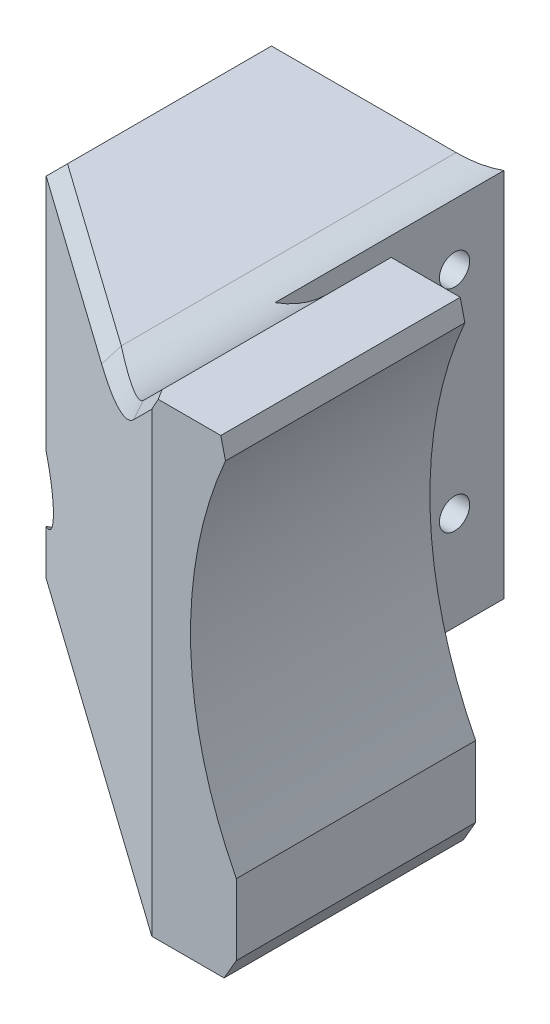
ISO-10303-21;
HEADER;
FILE_DESCRIPTION(('STEP AP214'),'2;1');
FILE_NAME('part.step','',(''),(''),'','','');
FILE_SCHEMA(('AUTOMOTIVE_DESIGN { 1 0 10303 214 1 1 1 1 }'));
ENDSEC;
DATA;
#1=APPLICATION_CONTEXT('core data for automotive mechanical design processes');
#2=APPLICATION_PROTOCOL_DEFINITION('international standard','automotive_design',2000,#1);
#3=PRODUCT_CONTEXT('',#1,'mechanical');
#4=PRODUCT('Part','Part','',(#3));
#5=PRODUCT_RELATED_PRODUCT_CATEGORY('part','',(#4));
#6=PRODUCT_DEFINITION_FORMATION('','',#4);
#7=PRODUCT_DEFINITION_CONTEXT('part definition',#1,'design');
#8=PRODUCT_DEFINITION('design','',#6,#7);
#9=PRODUCT_DEFINITION_SHAPE('','',#8);
#10=(LENGTH_UNIT() NAMED_UNIT(*) SI_UNIT(.MILLI.,.METRE.));
#11=(NAMED_UNIT(*) PLANE_ANGLE_UNIT() SI_UNIT($,.RADIAN.));
#12=(NAMED_UNIT(*) SI_UNIT($,.STERADIAN.) SOLID_ANGLE_UNIT());
#13=UNCERTAINTY_MEASURE_WITH_UNIT(LENGTH_MEASURE(1.E-05),#10,'distance_accuracy_value','');
#14=(GEOMETRIC_REPRESENTATION_CONTEXT(3) GLOBAL_UNCERTAINTY_ASSIGNED_CONTEXT((#13)) GLOBAL_UNIT_ASSIGNED_CONTEXT((#10,
#11,#12)) REPRESENTATION_CONTEXT('',''));
#15=CARTESIAN_POINT('',(0.,0.,0.));
#16=DIRECTION('',(0.,0.,1.));
#17=DIRECTION('',(1.,0.,0.));
#18=AXIS2_PLACEMENT_3D('',#15,#16,#17);
#19=CARTESIAN_POINT('',(63.5,44.,7.));
#20=DIRECTION('',(-1.,0.,0.));
#21=DIRECTION('',(0.,0.,1.));
#22=AXIS2_PLACEMENT_3D('',#19,#20,#21);
#23=CYLINDRICAL_SURFACE('',#22,2.15);
#24=CARTESIAN_POINT('',(35.,44.,7.));
#25=DIRECTION('',(-1.,0.,0.));
#26=DIRECTION('',(0.,0.,1.));
#27=AXIS2_PLACEMENT_3D('',#24,#25,#26);
#28=CIRCLE('',#27,2.15);
#29=CARTESIAN_POINT('',(35.,44.,9.15));
#30=VERTEX_POINT('',#29);
#31=EDGE_CURVE('E209',#30,#30,#28,.T.);
#32=ORIENTED_EDGE('',*,*,#31,.F.);
#33=EDGE_LOOP('',(#32));
#34=FACE_BOUND('',#33,.T.);
#35=CARTESIAN_POINT('',(25.,44.,7.));
#36=DIRECTION('',(-1.,0.,0.));
#37=DIRECTION('',(0.,0.,1.));
#38=AXIS2_PLACEMENT_3D('',#35,#36,#37);
#39=CIRCLE('',#38,2.15);
#40=CARTESIAN_POINT('',(25.,44.,9.15));
#41=VERTEX_POINT('',#40);
#42=EDGE_CURVE('E212',#41,#41,#39,.F.);
#43=ORIENTED_EDGE('',*,*,#42,.F.);
#44=EDGE_LOOP('',(#43));
#45=FACE_BOUND('',#44,.T.);
#46=ADVANCED_FACE('F41',(#34,#45),#23,.F.);
#47=CARTESIAN_POINT('',(63.5,14.,7.));
#48=DIRECTION('',(-1.,0.,0.));
#49=DIRECTION('',(0.,0.,1.));
#50=AXIS2_PLACEMENT_3D('',#47,#48,#49);
#51=CYLINDRICAL_SURFACE('',#50,2.15);
#52=CARTESIAN_POINT('',(35.,14.,7.));
#53=DIRECTION('',(-1.,0.,0.));
#54=DIRECTION('',(0.,0.,1.));
#55=AXIS2_PLACEMENT_3D('',#52,#53,#54);
#56=CIRCLE('',#55,2.15);
#57=CARTESIAN_POINT('',(35.,14.,9.15));
#58=VERTEX_POINT('',#57);
#59=EDGE_CURVE('E178',#58,#58,#56,.T.);
#60=ORIENTED_EDGE('',*,*,#59,.F.);
#61=EDGE_LOOP('',(#60));
#62=FACE_BOUND('',#61,.T.);
#63=CARTESIAN_POINT('',(25.,14.,7.));
#64=DIRECTION('',(-1.,0.,0.));
#65=DIRECTION('',(0.,0.,1.));
#66=AXIS2_PLACEMENT_3D('',#63,#64,#65);
#67=CIRCLE('',#66,2.15);
#68=CARTESIAN_POINT('',(25.,14.,9.15));
#69=VERTEX_POINT('',#68);
#70=EDGE_CURVE('E215',#69,#69,#67,.F.);
#71=ORIENTED_EDGE('',*,*,#70,.F.);
#72=EDGE_LOOP('',(#71));
#73=FACE_BOUND('',#72,.T.);
#74=ADVANCED_FACE('F352',(#62,#73),#51,.F.);
#75=CARTESIAN_POINT('',(0.,51.5,0.));
#76=DIRECTION('',(0.,-1.,0.));
#77=DIRECTION('',(0.,0.,-1.));
#78=AXIS2_PLACEMENT_3D('',#75,#76,#77);
#79=PLANE('',#78);
#80=DIRECTION('',(0.,0.,1.));
#81=VECTOR('',#80,1.);
#82=CARTESIAN_POINT('',(2.00000000000002,51.5,0.));
#83=LINE('',#82,#81);
#84=CARTESIAN_POINT('',(2.00000000000002,51.5,0.));
#85=VERTEX_POINT('',#84);
#86=CARTESIAN_POINT('',(2.00000000000002,51.5,28.9661011260373));
#87=VERTEX_POINT('',#86);
#88=EDGE_CURVE('E68',#85,#87,#83,.T.);
#89=ORIENTED_EDGE('',*,*,#88,.T.);
#90=DIRECTION('',(0.815868777571545,0.,0.578237094783716));
#91=VECTOR('',#90,1.);
#92=CARTESIAN_POINT('',(-12.9964935604639,51.5,18.3375183113395));
#93=LINE('',#92,#91);
#94=CARTESIAN_POINT('',(28.2157287525381,51.5,47.5461807273506));
#95=VERTEX_POINT('',#94);
#96=EDGE_CURVE('E435',#87,#95,#93,.T.);
#97=ORIENTED_EDGE('',*,*,#96,.T.);
#98=DIRECTION('',(0.,0.,1.));
#99=VECTOR('',#98,1.);
#100=CARTESIAN_POINT('',(28.2157287525381,51.5,32.5));
#101=LINE('',#100,#99);
#102=CARTESIAN_POINT('',(28.2157287525381,51.5,0.));
#103=VERTEX_POINT('',#102);
#104=EDGE_CURVE('E208',#95,#103,#101,.F.);
#105=ORIENTED_EDGE('',*,*,#104,.T.);
#106=DIRECTION('',(-1.,0.,0.));
#107=VECTOR('',#106,1.);
#108=CARTESIAN_POINT('',(0.,51.5,0.));
#109=LINE('',#108,#107);
#110=EDGE_CURVE('E484',#103,#85,#109,.T.);
#111=ORIENTED_EDGE('',*,*,#110,.T.);
#112=EDGE_LOOP('',(#89,#97,#105,#111));
#113=FACE_BOUND('',#112,.T.);
#114=ADVANCED_FACE('F359',(#113),#79,.F.);
#115=CARTESIAN_POINT('',(0.,51.5,30.));
#116=DIRECTION('',(1.,0.,0.));
#117=DIRECTION('',(0.,0.,-1.));
#118=AXIS2_PLACEMENT_3D('',#115,#116,#117);
#119=PLANE('',#118);
#120=CARTESIAN_POINT('',(0.,44.,7.));
#121=DIRECTION('',(-1.,0.,0.));
#122=DIRECTION('',(0.,0.,1.));
#123=AXIS2_PLACEMENT_3D('',#120,#121,#122);
#124=CIRCLE('',#123,4.5);
#125=CARTESIAN_POINT('',(0.,44.,11.5));
#126=VERTEX_POINT('',#125);
#127=EDGE_CURVE('E527',#126,#126,#124,.T.);
#128=ORIENTED_EDGE('',*,*,#127,.F.);
#129=EDGE_LOOP('',(#128));
#130=FACE_BOUND('',#129,.T.);
#131=CARTESIAN_POINT('',(0.,14.,7.));
#132=DIRECTION('',(-1.,0.,0.));
#133=DIRECTION('',(0.,0.,1.));
#134=AXIS2_PLACEMENT_3D('',#131,#132,#133);
#135=CIRCLE('',#134,4.5);
#136=CARTESIAN_POINT('',(0.,14.,11.5));
#137=VERTEX_POINT('',#136);
#138=EDGE_CURVE('E442',#137,#137,#135,.T.);
#139=ORIENTED_EDGE('',*,*,#138,.F.);
#140=EDGE_LOOP('',(#139));
#141=FACE_BOUND('',#140,.T.);
#142=DIRECTION('',(0.,-1.,0.));
#143=VECTOR('',#142,1.);
#144=CARTESIAN_POINT('',(0.,51.5,30.));
#145=LINE('',#144,#143);
#146=CARTESIAN_POINT('',(0.,49.5,30.));
#147=VERTEX_POINT('',#146);
#148=CARTESIAN_POINT('',(0.,15.6097722286464,30.));
#149=VERTEX_POINT('',#148);
#150=EDGE_CURVE('E203',#147,#149,#145,.T.);
#151=ORIENTED_EDGE('',*,*,#150,.F.);
#152=DIRECTION('',(0.,0.,-1.));
#153=VECTOR('',#152,1.);
#154=CARTESIAN_POINT('',(0.,49.5,30.));
#155=LINE('',#154,#153);
#156=CARTESIAN_POINT('',(0.,49.5,0.));
#157=VERTEX_POINT('',#156);
#158=EDGE_CURVE('E53',#147,#157,#155,.T.);
#159=ORIENTED_EDGE('',*,*,#158,.T.);
#160=DIRECTION('',(0.,-1.,0.));
#161=VECTOR('',#160,1.);
#162=CARTESIAN_POINT('',(0.,51.5,0.));
#163=LINE('',#162,#161);
#164=CARTESIAN_POINT('',(0.,0.,0.));
#165=VERTEX_POINT('',#164);
#166=EDGE_CURVE('E486',#157,#165,#163,.T.);
#167=ORIENTED_EDGE('',*,*,#166,.T.);
#168=DIRECTION('',(0.,0.,1.));
#169=VECTOR('',#168,1.);
#170=CARTESIAN_POINT('',(0.,0.,30.));
#171=LINE('',#170,#169);
#172=CARTESIAN_POINT('',(0.,0.,30.));
#173=VERTEX_POINT('',#172);
#174=EDGE_CURVE('E483',#165,#173,#171,.T.);
#175=ORIENTED_EDGE('',*,*,#174,.T.);
#176=CARTESIAN_POINT('',(0.,6.39022777135356,30.));
#177=VERTEX_POINT('',#176);
#178=EDGE_CURVE('E197',#177,#173,#145,.T.);
#179=ORIENTED_EDGE('',*,*,#178,.F.);
#180=CARTESIAN_POINT('',(0.,11.,27.));
#181=DIRECTION('',(1.,0.,0.));
#182=DIRECTION('',(0.,0.,-1.));
#183=AXIS2_PLACEMENT_3D('',#180,#181,#182);
#184=CIRCLE('',#183,5.5);
#185=EDGE_CURVE('E473',#177,#149,#184,.T.);
#186=ORIENTED_EDGE('',*,*,#185,.T.);
#187=EDGE_LOOP('',(#151,#159,#167,#175,#179,#186));
#188=FACE_BOUND('',#187,.T.);
#189=ADVANCED_FACE('F379',(#130,#141,#188),#119,.F.);
#190=CARTESIAN_POINT('',(51.5,51.5,66.5));
#191=DIRECTION('',(0.578237094783716,0.,-0.815868777571545));
#192=DIRECTION('',(-0.815868777571545,0.,-0.578237094783716));
#193=AXIS2_PLACEMENT_3D('',#190,#191,#192);
#194=PLANE('',#193);
#195=DIRECTION('',(0.,-1.,0.));
#196=VECTOR('',#195,1.);
#197=CARTESIAN_POINT('',(51.5,51.5,66.5));
#198=LINE('',#197,#196);
#199=CARTESIAN_POINT('',(51.5,64.8280470648213,66.5));
#200=VERTEX_POINT('',#199);
#201=CARTESIAN_POINT('',(51.5,0.,66.5));
#202=VERTEX_POINT('',#201);
#203=EDGE_CURVE('E195',#200,#202,#198,.T.);
#204=ORIENTED_EDGE('',*,*,#203,.F.);
#205=DIRECTION('',(-0.632163620757948,-0.632163620757954,-0.448038294323594));
#206=VECTOR('',#205,1.);
#207=CARTESIAN_POINT('',(46.1737013104799,59.5017483753012,62.7250504433499));
#208=LINE('',#207,#206);
#209=CARTESIAN_POINT('',(42.6156037490748,55.943650813896,60.2032919774996));
#210=VERTEX_POINT('',#209);
#211=EDGE_CURVE('E420',#200,#210,#208,.T.);
#212=ORIENTED_EDGE('',*,*,#211,.T.);
#213=CARTESIAN_POINT('',(27.0592545629706,49.5,49.1779182824937));
#214=CARTESIAN_POINT('',(28.4991592437125,49.4999029895769,50.1984332503982));
#215=CARTESIAN_POINT('',(29.9390043290815,49.6418123628551,51.2189059808053));
#216=CARTESIAN_POINT('',(32.7634789655696,50.2036352994027,53.2207181018114));
#217=CARTESIAN_POINT('',(34.1479916094762,50.6236226183265,54.2019746358423));
#218=CARTESIAN_POINT('',(36.8085885405291,51.7256779511769,56.0876404219284));
#219=CARTESIAN_POINT('',(38.0845627005041,52.4077003488356,56.9919716226873));
#220=CARTESIAN_POINT('',(40.4790366782999,54.0076367098524,58.6890259952999));
#221=CARTESIAN_POINT('',(41.597505981788,54.9254158531533,59.4817275404905));
#222=CARTESIAN_POINT('',(42.6156037490748,55.943650813896,60.2032919774996));
#223=B_SPLINE_CURVE_WITH_KNOTS('',3,(#213,#214,#215,#216,#217,#218,#219,#220,#221,#222),
.UNSPECIFIED.,.F.,.F.,(4,2,2,2,4),(3.92699081698724,4.1233403578366,4.31968989868596,
4.51603943953533,4.71238898038469),.UNSPECIFIED.);
#224=CARTESIAN_POINT('',(27.0592545629706,49.5,49.1779182824937));
#225=VERTEX_POINT('',#224);
#226=EDGE_CURVE('E416',#210,#225,#223,.F.);
#227=ORIENTED_EDGE('',*,*,#226,.T.);
#228=DIRECTION('',(-0.815868777571545,0.,-0.578237094783716));
#229=VECTOR('',#228,1.);
#230=CARTESIAN_POINT('',(51.5,49.5,66.5));
#231=LINE('',#230,#229);
#232=EDGE_CURVE('E409',#225,#147,#231,.T.);
#233=ORIENTED_EDGE('',*,*,#232,.T.);
#234=ORIENTED_EDGE('',*,*,#150,.T.);
#235=CARTESIAN_POINT('',(-4.23287671232877,11.,27.));
#236=DIRECTION('',(0.578237094783716,0.,-0.815868777571545));
#237=DIRECTION('',(0.815868777571545,0.,0.578237094783716));
#238=AXIS2_PLACEMENT_3D('',#235,#236,#237);
#239=ELLIPSE('',#238,9.51166926095812,5.5);
#240=EDGE_CURVE('E479',#149,#177,#239,.T.);
#241=ORIENTED_EDGE('',*,*,#240,.T.);
#242=ORIENTED_EDGE('',*,*,#178,.T.);
#243=DIRECTION('',(0.815868777571545,0.,0.578237094783716));
#244=VECTOR('',#243,1.);
#245=CARTESIAN_POINT('',(51.5,0.,66.5));
#246=LINE('',#245,#244);
#247=EDGE_CURVE('E448',#173,#202,#246,.T.);
#248=ORIENTED_EDGE('',*,*,#247,.T.);
#249=EDGE_LOOP('',(#204,#212,#227,#233,#234,#241,#242,#248));
#250=FACE_BOUND('',#249,.T.);
#251=ADVANCED_FACE('F399',(#250),#194,.F.);
#252=CARTESIAN_POINT('',(63.5,51.5,66.5));
#253=DIRECTION('',(0.,0.,-1.));
#254=DIRECTION('',(-1.,0.,0.));
#255=AXIS2_PLACEMENT_3D('',#252,#253,#254);
#256=PLANE('',#255);
#257=DIRECTION('',(1.,0.,0.));
#258=VECTOR('',#257,1.);
#259=CARTESIAN_POINT('',(63.5,66.5,66.5));
#260=LINE('',#259,#258);
#261=CARTESIAN_POINT('',(52.4197921897727,66.5,66.5));
#262=VERTEX_POINT('',#261);
#263=CARTESIAN_POINT('',(61.3045533800256,66.5,66.5));
#264=VERTEX_POINT('',#263);
#265=EDGE_CURVE('E469',#262,#264,#260,.T.);
#266=ORIENTED_EDGE('',*,*,#265,.F.);
#267=DIRECTION('',(-0.482006486250864,-0.876167647891713,0.));
#268=VECTOR('',#267,1.);
#269=CARTESIAN_POINT('',(48.0131452627776,58.489814279999,66.5));
#270=LINE('',#269,#268);
#271=EDGE_CURVE('E229',#262,#200,#270,.T.);
#272=ORIENTED_EDGE('',*,*,#271,.T.);
#273=ORIENTED_EDGE('',*,*,#203,.T.);
#274=DIRECTION('',(1.,0.,0.));
#275=VECTOR('',#274,1.);
#276=CARTESIAN_POINT('',(63.5,0.,66.5));
#277=LINE('',#276,#275);
#278=CARTESIAN_POINT('',(61.7679491924312,0.,66.5));
#279=VERTEX_POINT('',#278);
#280=EDGE_CURVE('E450',#202,#279,#277,.T.);
#281=ORIENTED_EDGE('',*,*,#280,.T.);
#282=DIRECTION('',(0.499999999999997,0.86602540378444,0.));
#283=VECTOR('',#282,1.);
#284=CARTESIAN_POINT('',(63.5,3.,66.5));
#285=LINE('',#284,#283);
#286=CARTESIAN_POINT('',(63.5,3.,66.5));
#287=VERTEX_POINT('',#286);
#288=EDGE_CURVE('E194',#279,#287,#285,.T.);
#289=ORIENTED_EDGE('',*,*,#288,.T.);
#290=DIRECTION('',(0.,-1.,0.));
#291=VECTOR('',#290,1.);
#292=CARTESIAN_POINT('',(63.5,51.5,66.5));
#293=LINE('',#292,#291);
#294=CARTESIAN_POINT('',(63.5,13.0788187480564,66.5));
#295=VERTEX_POINT('',#294);
#296=EDGE_CURVE('E184',#295,#287,#293,.T.);
#297=ORIENTED_EDGE('',*,*,#296,.F.);
#298=CARTESIAN_POINT('',(116.,40.,66.5));
#299=DIRECTION('',(0.,0.,1.));
#300=DIRECTION('',(1.,0.,0.));
#301=AXIS2_PLACEMENT_3D('',#298,#299,#300);
#302=CIRCLE('',#301,59.);
#303=CARTESIAN_POINT('',(61.9678246627246,63.696498229104,66.5));
#304=VERTEX_POINT('',#303);
#305=EDGE_CURVE('E166',#304,#295,#302,.T.);
#306=ORIENTED_EDGE('',*,*,#305,.F.);
#307=DIRECTION('',(0.230231050966932,-0.97313599418101,0.));
#308=VECTOR('',#307,1.);
#309=CARTESIAN_POINT('',(61.9678246627246,63.696498229104,66.5));
#310=LINE('',#309,#308);
#311=EDGE_CURVE('E457',#304,#264,#310,.F.);
#312=ORIENTED_EDGE('',*,*,#311,.T.);
#313=EDGE_LOOP('',(#266,#272,#273,#281,#289,#297,#306,#312));
#314=FACE_BOUND('',#313,.T.);
#315=ADVANCED_FACE('F191',(#314),#256,.F.);
#316=CARTESIAN_POINT('',(63.5,51.5,32.5));
#317=DIRECTION('',(-1.,0.,0.));
#318=DIRECTION('',(0.,0.,1.));
#319=AXIS2_PLACEMENT_3D('',#316,#317,#318);
#320=PLANE('',#319);
#321=ORIENTED_EDGE('',*,*,#296,.T.);
#322=DIRECTION('',(0.,0.,-1.));
#323=VECTOR('',#322,1.);
#324=CARTESIAN_POINT('',(63.5,3.,32.5));
#325=LINE('',#324,#323);
#326=CARTESIAN_POINT('',(63.5,3.,32.5));
#327=VERTEX_POINT('',#326);
#328=EDGE_CURVE('E455',#287,#327,#325,.T.);
#329=ORIENTED_EDGE('',*,*,#328,.T.);
#330=DIRECTION('',(0.,-1.,0.));
#331=VECTOR('',#330,1.);
#332=CARTESIAN_POINT('',(63.5,51.5,32.5));
#333=LINE('',#332,#331);
#334=CARTESIAN_POINT('',(63.5,13.0788187480564,32.5));
#335=VERTEX_POINT('',#334);
#336=EDGE_CURVE('E187',#335,#327,#333,.T.);
#337=ORIENTED_EDGE('',*,*,#336,.F.);
#338=DIRECTION('',(0.,0.,1.));
#339=VECTOR('',#338,1.);
#340=CARTESIAN_POINT('',(63.5,13.0788187480564,0.));
#341=LINE('',#340,#339);
#342=EDGE_CURVE('E170',#335,#295,#341,.T.);
#343=ORIENTED_EDGE('',*,*,#342,.T.);
#344=EDGE_LOOP('',(#321,#329,#337,#343));
#345=FACE_BOUND('',#344,.T.);
#346=ADVANCED_FACE('F182',(#345),#320,.F.);
#347=CARTESIAN_POINT('',(35.,51.5,32.5));
#348=DIRECTION('',(0.,0.,1.));
#349=DIRECTION('',(1.,0.,0.));
#350=AXIS2_PLACEMENT_3D('',#347,#348,#349);
#351=PLANE('',#350);
#352=DIRECTION('',(-1.,0.,0.));
#353=VECTOR('',#352,1.);
#354=CARTESIAN_POINT('',(63.5,66.5,32.5));
#355=LINE('',#354,#353);
#356=CARTESIAN_POINT('',(61.3045533800256,66.5,32.5));
#357=VERTEX_POINT('',#356);
#358=CARTESIAN_POINT('',(51.5,66.5,32.5));
#359=VERTEX_POINT('',#358);
#360=EDGE_CURVE('E188',#357,#359,#355,.T.);
#361=ORIENTED_EDGE('',*,*,#360,.F.);
#362=DIRECTION('',(-0.230231050966932,0.97313599418101,0.));
#363=VECTOR('',#362,1.);
#364=CARTESIAN_POINT('',(61.9678246627246,63.696498229104,32.5));
#365=LINE('',#364,#363);
#366=CARTESIAN_POINT('',(61.9678246627246,63.696498229104,32.5));
#367=VERTEX_POINT('',#366);
#368=EDGE_CURVE('E417',#357,#367,#365,.F.);
#369=ORIENTED_EDGE('',*,*,#368,.T.);
#370=CARTESIAN_POINT('',(116.,40.,32.5));
#371=DIRECTION('',(0.,0.,1.));
#372=DIRECTION('',(1.,0.,0.));
#373=AXIS2_PLACEMENT_3D('',#370,#371,#372);
#374=CIRCLE('',#373,59.);
#375=EDGE_CURVE('E177',#367,#335,#374,.T.);
#376=ORIENTED_EDGE('',*,*,#375,.T.);
#377=ORIENTED_EDGE('',*,*,#336,.T.);
#378=DIRECTION('',(-0.499999999999997,-0.86602540378444,0.));
#379=VECTOR('',#378,1.);
#380=CARTESIAN_POINT('',(63.5,3.,32.5));
#381=LINE('',#380,#379);
#382=CARTESIAN_POINT('',(61.7679491924312,0.,32.5));
#383=VERTEX_POINT('',#382);
#384=EDGE_CURVE('E459',#327,#383,#381,.T.);
#385=ORIENTED_EDGE('',*,*,#384,.T.);
#386=DIRECTION('',(-1.,0.,0.));
#387=VECTOR('',#386,1.);
#388=CARTESIAN_POINT('',(35.,0.,32.5));
#389=LINE('',#388,#387);
#390=CARTESIAN_POINT('',(35.,0.,32.5));
#391=VERTEX_POINT('',#390);
#392=EDGE_CURVE('E451',#383,#391,#389,.T.);
#393=ORIENTED_EDGE('',*,*,#392,.T.);
#394=DIRECTION('',(0.,-1.,0.));
#395=VECTOR('',#394,1.);
#396=CARTESIAN_POINT('',(35.,51.5,32.5));
#397=LINE('',#396,#395);
#398=CARTESIAN_POINT('',(35.,11.,32.5));
#399=VERTEX_POINT('',#398);
#400=EDGE_CURVE('E499',#399,#391,#397,.T.);
#401=ORIENTED_EDGE('',*,*,#400,.F.);
#402=CARTESIAN_POINT('',(35.,52.6858121716386,32.5));
#403=VERTEX_POINT('',#402);
#404=EDGE_CURVE('E199',#403,#399,#397,.T.);
#405=ORIENTED_EDGE('',*,*,#404,.F.);
#406=CARTESIAN_POINT('',(28.2157287525381,71.5,32.5));
#407=DIRECTION('',(0.,0.,1.));
#408=DIRECTION('',(1.,0.,0.));
#409=AXIS2_PLACEMENT_3D('',#406,#407,#408);
#410=CIRCLE('',#409,20.);
#411=CARTESIAN_POINT('',(42.3578643762691,57.3578643762691,32.5));
#412=VERTEX_POINT('',#411);
#413=EDGE_CURVE('E517',#403,#412,#410,.T.);
#414=ORIENTED_EDGE('',*,*,#413,.T.);
#415=DIRECTION('',(-0.707106781186544,-0.707106781186551,0.));
#416=VECTOR('',#415,1.);
#417=CARTESIAN_POINT('',(35.75,50.75,32.5));
#418=LINE('',#417,#416);
#419=EDGE_CURVE('E205',#412,#359,#418,.F.);
#420=ORIENTED_EDGE('',*,*,#419,.T.);
#421=EDGE_LOOP('',(#361,#369,#376,#377,#385,#393,#401,#405,#414,#420));
#422=FACE_BOUND('',#421,.T.);
#423=ADVANCED_FACE('F390',(#422),#351,.F.);
#424=CARTESIAN_POINT('',(35.,51.5,0.));
#425=DIRECTION('',(-1.,0.,0.));
#426=DIRECTION('',(0.,0.,1.));
#427=AXIS2_PLACEMENT_3D('',#424,#425,#426);
#428=PLANE('',#427);
#429=ORIENTED_EDGE('',*,*,#59,.T.);
#430=EDGE_LOOP('',(#429));
#431=FACE_BOUND('',#430,.T.);
#432=ORIENTED_EDGE('',*,*,#31,.T.);
#433=EDGE_LOOP('',(#432));
#434=FACE_BOUND('',#433,.T.);
#435=ORIENTED_EDGE('',*,*,#404,.T.);
#436=CARTESIAN_POINT('',(35.,11.,27.));
#437=DIRECTION('',(1.,0.,0.));
#438=DIRECTION('',(0.,0.,-1.));
#439=AXIS2_PLACEMENT_3D('',#436,#437,#438);
#440=CIRCLE('',#439,5.5);
#441=EDGE_CURVE('E470',#399,#399,#440,.T.);
#442=ORIENTED_EDGE('',*,*,#441,.F.);
#443=ORIENTED_EDGE('',*,*,#400,.T.);
#444=DIRECTION('',(0.,0.,-1.));
#445=VECTOR('',#444,1.);
#446=CARTESIAN_POINT('',(35.,0.,0.));
#447=LINE('',#446,#445);
#448=CARTESIAN_POINT('',(35.,0.,0.));
#449=VERTEX_POINT('',#448);
#450=EDGE_CURVE('E492',#391,#449,#447,.T.);
#451=ORIENTED_EDGE('',*,*,#450,.T.);
#452=DIRECTION('',(0.,-1.,0.));
#453=VECTOR('',#452,1.);
#454=CARTESIAN_POINT('',(35.,51.5,0.));
#455=LINE('',#454,#453);
#456=CARTESIAN_POINT('',(35.,52.6858121716386,0.));
#457=VERTEX_POINT('',#456);
#458=EDGE_CURVE('E497',#457,#449,#455,.T.);
#459=ORIENTED_EDGE('',*,*,#458,.F.);
#460=DIRECTION('',(0.,0.,-1.));
#461=VECTOR('',#460,1.);
#462=CARTESIAN_POINT('',(35.,52.6858121716386,0.));
#463=LINE('',#462,#461);
#464=EDGE_CURVE('E515',#457,#403,#463,.F.);
#465=ORIENTED_EDGE('',*,*,#464,.T.);
#466=EDGE_LOOP('',(#435,#442,#443,#451,#459,#465));
#467=FACE_BOUND('',#466,.T.);
#468=ADVANCED_FACE('F386',(#431,#434,#467),#428,.F.);
#469=CARTESIAN_POINT('',(0.,51.5,0.));
#470=DIRECTION('',(0.,0.,1.));
#471=DIRECTION('',(1.,0.,0.));
#472=AXIS2_PLACEMENT_3D('',#469,#470,#471);
#473=PLANE('',#472);
#474=ORIENTED_EDGE('',*,*,#166,.F.);
#475=DIRECTION('',(-0.707106781186548,-0.707106781186548,0.));
#476=VECTOR('',#475,1.);
#477=CARTESIAN_POINT('',(2.00000000000002,51.5,0.));
#478=LINE('',#477,#476);
#479=EDGE_CURVE('E11',#157,#85,#478,.F.);
#480=ORIENTED_EDGE('',*,*,#479,.T.);
#481=ORIENTED_EDGE('',*,*,#110,.F.);
#482=CARTESIAN_POINT('',(28.2157287525381,71.5,0.));
#483=DIRECTION('',(0.,0.,1.));
#484=DIRECTION('',(1.,0.,0.));
#485=AXIS2_PLACEMENT_3D('',#482,#483,#484);
#486=CIRCLE('',#485,20.);
#487=EDGE_CURVE('E427',#103,#457,#486,.T.);
#488=ORIENTED_EDGE('',*,*,#487,.T.);
#489=ORIENTED_EDGE('',*,*,#458,.T.);
#490=DIRECTION('',(-1.,0.,0.));
#491=VECTOR('',#490,1.);
#492=CARTESIAN_POINT('',(0.,0.,0.));
#493=LINE('',#492,#491);
#494=EDGE_CURVE('E487',#449,#165,#493,.T.);
#495=ORIENTED_EDGE('',*,*,#494,.T.);
#496=EDGE_LOOP('',(#474,#480,#481,#488,#489,#495));
#497=FACE_BOUND('',#496,.T.);
#498=ADVANCED_FACE('F382',(#497),#473,.F.);
#499=CARTESIAN_POINT('',(0.,0.,0.));
#500=DIRECTION('',(0.,-1.,0.));
#501=DIRECTION('',(0.,0.,-1.));
#502=AXIS2_PLACEMENT_3D('',#499,#500,#501);
#503=PLANE('',#502);
#504=ORIENTED_EDGE('',*,*,#392,.F.);
#505=DIRECTION('',(0.,0.,1.));
#506=VECTOR('',#505,1.);
#507=CARTESIAN_POINT('',(61.7679491924312,0.,66.5));
#508=LINE('',#507,#506);
#509=EDGE_CURVE('E454',#383,#279,#508,.T.);
#510=ORIENTED_EDGE('',*,*,#509,.T.);
#511=ORIENTED_EDGE('',*,*,#280,.F.);
#512=ORIENTED_EDGE('',*,*,#247,.F.);
#513=ORIENTED_EDGE('',*,*,#174,.F.);
#514=ORIENTED_EDGE('',*,*,#494,.F.);
#515=ORIENTED_EDGE('',*,*,#450,.F.);
#516=EDGE_LOOP('',(#504,#510,#511,#512,#513,#514,#515));
#517=FACE_BOUND('',#516,.T.);
#518=ADVANCED_FACE('F375',(#517),#503,.T.);
#519=CARTESIAN_POINT('',(0.,11.,27.));
#520=DIRECTION('',(1.,0.,0.));
#521=DIRECTION('',(0.,0.,-1.));
#522=AXIS2_PLACEMENT_3D('',#519,#520,#521);
#523=CYLINDRICAL_SURFACE('',#522,5.5);
#524=ORIENTED_EDGE('',*,*,#441,.T.);
#525=EDGE_LOOP('',(#524));
#526=FACE_BOUND('',#525,.T.);
#527=ORIENTED_EDGE('',*,*,#185,.F.);
#528=ORIENTED_EDGE('',*,*,#240,.F.);
#529=EDGE_LOOP('',(#527,#528));
#530=FACE_BOUND('',#529,.T.);
#531=ADVANCED_FACE('F372',(#526,#530),#523,.F.);
#532=CARTESIAN_POINT('',(0.,66.5,0.));
#533=DIRECTION('',(0.,1.,0.));
#534=DIRECTION('',(0.,0.,1.));
#535=AXIS2_PLACEMENT_3D('',#532,#533,#534);
#536=PLANE('',#535);
#537=DIRECTION('',(0.,0.,1.));
#538=VECTOR('',#537,1.);
#539=CARTESIAN_POINT('',(51.5,66.5,66.5));
#540=LINE('',#539,#538);
#541=CARTESIAN_POINT('',(51.5,66.5,65.0509320974279));
#542=VERTEX_POINT('',#541);
#543=EDGE_CURVE('E471',#359,#542,#540,.T.);
#544=ORIENTED_EDGE('',*,*,#543,.T.);
#545=DIRECTION('',(0.535903938865071,0.,0.844278963559381));
#546=VECTOR('',#545,1.);
#547=CARTESIAN_POINT('',(7.27710708236052,66.5,-4.61912533333613));
#548=LINE('',#547,#546);
#549=EDGE_CURVE('E429',#542,#262,#548,.T.);
#550=ORIENTED_EDGE('',*,*,#549,.T.);
#551=ORIENTED_EDGE('',*,*,#265,.T.);
#552=DIRECTION('',(0.,0.,-1.));
#553=VECTOR('',#552,1.);
#554=CARTESIAN_POINT('',(61.3045533800256,66.5,32.5));
#555=LINE('',#554,#553);
#556=EDGE_CURVE('E464',#264,#357,#555,.T.);
#557=ORIENTED_EDGE('',*,*,#556,.T.);
#558=ORIENTED_EDGE('',*,*,#360,.T.);
#559=EDGE_LOOP('',(#544,#550,#551,#557,#558));
#560=FACE_BOUND('',#559,.T.);
#561=ADVANCED_FACE('F369',(#560),#536,.T.);
#562=CARTESIAN_POINT('',(51.5,66.5000000000001,66.5));
#563=DIRECTION('',(-0.707106781186551,0.707106781186544,0.));
#564=DIRECTION('',(0.,0.,-1.));
#565=AXIS2_PLACEMENT_3D('',#562,#563,#564);
#566=PLANE('',#565);
#567=DIRECTION('',(0.,0.,-1.));
#568=VECTOR('',#567,1.);
#569=CARTESIAN_POINT('',(42.3578643762691,57.3578643762691,55.868932038835));
#570=LINE('',#569,#568);
#571=CARTESIAN_POINT('',(42.3578643762691,57.3578643762691,58.5715544223546));
#572=VERTEX_POINT('',#571);
#573=EDGE_CURVE('E228',#412,#572,#570,.F.);
#574=ORIENTED_EDGE('',*,*,#573,.T.);
#575=DIRECTION('',(-0.632163620757948,-0.632163620757954,-0.448038294323594));
#576=VECTOR('',#575,1.);
#577=CARTESIAN_POINT('',(51.9104245888213,66.9104245888214,65.3418155438741));
#578=LINE('',#577,#576);
#579=EDGE_CURVE('E423',#572,#542,#578,.F.);
#580=ORIENTED_EDGE('',*,*,#579,.T.);
#581=ORIENTED_EDGE('',*,*,#543,.F.);
#582=ORIENTED_EDGE('',*,*,#419,.F.);
#583=EDGE_LOOP('',(#574,#580,#581,#582));
#584=FACE_BOUND('',#583,.T.);
#585=ADVANCED_FACE('F256',(#584),#566,.T.);
#586=CARTESIAN_POINT('',(116.,40.,0.));
#587=DIRECTION('',(0.,0.,1.));
#588=DIRECTION('',(1.,0.,0.));
#589=AXIS2_PLACEMENT_3D('',#586,#587,#588);
#590=CYLINDRICAL_SURFACE('',#589,59.);
#591=ORIENTED_EDGE('',*,*,#375,.F.);
#592=DIRECTION('',(0.,0.,1.));
#593=VECTOR('',#592,1.);
#594=CARTESIAN_POINT('',(61.9678246627246,63.696498229104,0.));
#595=LINE('',#594,#593);
#596=EDGE_CURVE('E173',#367,#304,#595,.T.);
#597=ORIENTED_EDGE('',*,*,#596,.T.);
#598=ORIENTED_EDGE('',*,*,#305,.T.);
#599=ORIENTED_EDGE('',*,*,#342,.F.);
#600=EDGE_LOOP('',(#591,#597,#598,#599));
#601=FACE_BOUND('',#600,.T.);
#602=ADVANCED_FACE('F169',(#601),#590,.F.);
#603=CARTESIAN_POINT('',(25.,14.,7.));
#604=DIRECTION('',(-1.,0.,0.));
#605=DIRECTION('',(0.,0.,1.));
#606=AXIS2_PLACEMENT_3D('',#603,#604,#605);
#607=PLANE('',#606);
#608=CARTESIAN_POINT('',(25.,14.,7.));
#609=DIRECTION('',(-1.,0.,0.));
#610=DIRECTION('',(0.,0.,1.));
#611=AXIS2_PLACEMENT_3D('',#608,#609,#610);
#612=CIRCLE('',#611,4.5);
#613=CARTESIAN_POINT('',(25.,14.,11.5));
#614=VERTEX_POINT('',#613);
#615=EDGE_CURVE('E440',#614,#614,#612,.T.);
#616=ORIENTED_EDGE('',*,*,#615,.T.);
#617=EDGE_LOOP('',(#616));
#618=FACE_BOUND('',#617,.T.);
#619=ORIENTED_EDGE('',*,*,#70,.T.);
#620=EDGE_LOOP('',(#619));
#621=FACE_BOUND('',#620,.T.);
#622=ADVANCED_FACE('F368',(#618,#621),#607,.T.);
#623=CARTESIAN_POINT('',(25.,14.,7.));
#624=DIRECTION('',(-1.,0.,0.));
#625=DIRECTION('',(0.,0.,1.));
#626=AXIS2_PLACEMENT_3D('',#623,#624,#625);
#627=CYLINDRICAL_SURFACE('',#626,4.5);
#628=ORIENTED_EDGE('',*,*,#615,.F.);
#629=EDGE_LOOP('',(#628));
#630=FACE_BOUND('',#629,.T.);
#631=ORIENTED_EDGE('',*,*,#138,.T.);
#632=EDGE_LOOP('',(#631));
#633=FACE_BOUND('',#632,.T.);
#634=ADVANCED_FACE('F548',(#630,#633),#627,.F.);
#635=CARTESIAN_POINT('',(25.,44.,7.));
#636=DIRECTION('',(-1.,0.,0.));
#637=DIRECTION('',(0.,0.,1.));
#638=AXIS2_PLACEMENT_3D('',#635,#636,#637);
#639=PLANE('',#638);
#640=CARTESIAN_POINT('',(25.,44.,7.));
#641=DIRECTION('',(-1.,0.,0.));
#642=DIRECTION('',(0.,0.,1.));
#643=AXIS2_PLACEMENT_3D('',#640,#641,#642);
#644=CIRCLE('',#643,4.5);
#645=CARTESIAN_POINT('',(25.,44.,11.5));
#646=VERTEX_POINT('',#645);
#647=EDGE_CURVE('E218',#646,#646,#644,.T.);
#648=ORIENTED_EDGE('',*,*,#647,.T.);
#649=EDGE_LOOP('',(#648));
#650=FACE_BOUND('',#649,.T.);
#651=ORIENTED_EDGE('',*,*,#42,.T.);
#652=EDGE_LOOP('',(#651));
#653=FACE_BOUND('',#652,.T.);
#654=ADVANCED_FACE('F533',(#650,#653),#639,.T.);
#655=CARTESIAN_POINT('',(25.,44.,7.));
#656=DIRECTION('',(-1.,0.,0.));
#657=DIRECTION('',(0.,0.,1.));
#658=AXIS2_PLACEMENT_3D('',#655,#656,#657);
#659=CYLINDRICAL_SURFACE('',#658,4.5);
#660=ORIENTED_EDGE('',*,*,#647,.F.);
#661=EDGE_LOOP('',(#660));
#662=FACE_BOUND('',#661,.T.);
#663=ORIENTED_EDGE('',*,*,#127,.T.);
#664=EDGE_LOOP('',(#663));
#665=FACE_BOUND('',#664,.T.);
#666=ADVANCED_FACE('F254',(#662,#665),#659,.F.);
#667=CARTESIAN_POINT('',(28.2157287525381,71.5,0.));
#668=DIRECTION('',(0.,0.,-1.));
#669=DIRECTION('',(-1.,0.,0.));
#670=AXIS2_PLACEMENT_3D('',#667,#668,#669);
#671=CYLINDRICAL_SURFACE('',#670,20.);
#672=ORIENTED_EDGE('',*,*,#104,.F.);
#673=CARTESIAN_POINT('',(42.3578643762691,57.3578643762691,58.5715544223565));
#674=CARTESIAN_POINT('',(41.4323209514629,56.4321962301394,57.8499899853474));
#675=CARTESIAN_POINT('',(40.4155306754893,55.5978515543609,57.057288440098));
#676=CARTESIAN_POINT('',(38.2387361503712,54.1433639535374,55.360234067603));
#677=CARTESIAN_POINT('',(37.0787596411207,53.5233435919347,54.4559028667019));
#678=CARTESIAN_POINT('',(34.6600351585591,52.5214751076138,52.5702370807825));
#679=CARTESIAN_POINT('',(33.4013873002311,52.1396684539778,51.5889805465715));
#680=CARTESIAN_POINT('',(30.8336830854904,51.628920329893,49.5871684257591));
#681=CARTESIAN_POINT('',(29.5247330077579,51.4999118087063,48.5666956952551));
#682=CARTESIAN_POINT('',(28.2157287525381,51.5,47.5461807273506));
#683=B_SPLINE_CURVE_WITH_KNOTS('',3,(#673,#674,#675,#676,#677,#678,#679,#680,#681,#682),
.UNSPECIFIED.,.F.,.F.,(4,2,2,2,4),(3.92699081698724,4.1233403578366,4.31968989868596,
4.51603943953533,4.71238898038469),.UNSPECIFIED.);
#684=EDGE_CURVE('E236',#95,#572,#683,.F.);
#685=ORIENTED_EDGE('',*,*,#684,.T.);
#686=ORIENTED_EDGE('',*,*,#573,.F.);
#687=ORIENTED_EDGE('',*,*,#413,.F.);
#688=ORIENTED_EDGE('',*,*,#464,.F.);
#689=ORIENTED_EDGE('',*,*,#487,.F.);
#690=EDGE_LOOP('',(#672,#685,#686,#687,#688,#689));
#691=FACE_BOUND('',#690,.T.);
#692=ADVANCED_FACE('F243',(#691),#671,.F.);
#693=CARTESIAN_POINT('',(63.5,3.,32.5));
#694=DIRECTION('',(0.86602540378444,-0.499999999999997,0.));
#695=DIRECTION('',(0.,0.,1.));
#696=AXIS2_PLACEMENT_3D('',#693,#694,#695);
#697=PLANE('',#696);
#698=ORIENTED_EDGE('',*,*,#288,.F.);
#699=ORIENTED_EDGE('',*,*,#509,.F.);
#700=ORIENTED_EDGE('',*,*,#384,.F.);
#701=ORIENTED_EDGE('',*,*,#328,.F.);
#702=EDGE_LOOP('',(#698,#699,#700,#701));
#703=FACE_BOUND('',#702,.T.);
#704=ADVANCED_FACE('F253',(#703),#697,.T.);
#705=CARTESIAN_POINT('',(61.9678246627246,63.696498229104,0.));
#706=DIRECTION('',(-0.97313599418101,-0.230231050966932,0.));
#707=DIRECTION('',(0.,0.,1.));
#708=AXIS2_PLACEMENT_3D('',#705,#706,#707);
#709=PLANE('',#708);
#710=ORIENTED_EDGE('',*,*,#368,.F.);
#711=ORIENTED_EDGE('',*,*,#556,.F.);
#712=ORIENTED_EDGE('',*,*,#311,.F.);
#713=ORIENTED_EDGE('',*,*,#596,.F.);
#714=EDGE_LOOP('',(#710,#711,#712,#713));
#715=FACE_BOUND('',#714,.T.);
#716=ADVANCED_FACE('F264',(#715),#709,.F.);
#717=CARTESIAN_POINT('',(2.00000000000002,51.5,0.));
#718=DIRECTION('',(0.707106781186547,-0.707106781186547,0.));
#719=DIRECTION('',(0.,0.,1.));
#720=AXIS2_PLACEMENT_3D('',#717,#718,#719);
#721=PLANE('',#720);
#722=ORIENTED_EDGE('',*,*,#479,.F.);
#723=ORIENTED_EDGE('',*,*,#158,.F.);
#724=DIRECTION('',(0.664127657247618,0.664127657247618,-0.343320418497911));
#725=VECTOR('',#724,1.);
#726=CARTESIAN_POINT('',(8.60451973715353,58.1045197371535,25.5518983663834));
#727=LINE('',#726,#725);
#728=EDGE_CURVE('E439',#87,#147,#727,.F.);
#729=ORIENTED_EDGE('',*,*,#728,.F.);
#730=ORIENTED_EDGE('',*,*,#88,.F.);
#731=EDGE_LOOP('',(#722,#723,#729,#730));
#732=FACE_BOUND('',#731,.T.);
#733=ADVANCED_FACE('F44',(#732),#721,.F.);
#734=CARTESIAN_POINT('',(-12.9964935604639,51.5,18.3375183113395));
#735=DIRECTION('',(0.408875370855174,-0.707106781186549,-0.576906345179218));
#736=DIRECTION('',(0.815868777571545,0.,0.578237094783716));
#737=AXIS2_PLACEMENT_3D('',#734,#735,#736);
#738=PLANE('',#737);
#739=ORIENTED_EDGE('',*,*,#728,.T.);
#740=ORIENTED_EDGE('',*,*,#232,.F.);
#741=CARTESIAN_POINT('',(28.2157287525381,51.5,47.5461807273506));
#742=CARTESIAN_POINT('',(27.0592545629706,49.5,49.1779182824937));
#743=B_SPLINE_CURVE_WITH_KNOTS('',1,(#741,#742),.UNSPECIFIED.,.F.,.F.,(2,2),(0.,1.),.UNSPECIFIED.);
#744=EDGE_CURVE('E319',#95,#225,#743,.T.);
#745=ORIENTED_EDGE('',*,*,#744,.F.);
#746=ORIENTED_EDGE('',*,*,#96,.F.);
#747=EDGE_LOOP('',(#739,#740,#745,#746));
#748=FACE_BOUND('',#747,.T.);
#749=ADVANCED_FACE('F335',(#748),#738,.F.);
#750=CARTESIAN_POINT('',(42.6156037490748,55.943650813896,60.2032919774996));
#751=CARTESIAN_POINT('',(41.597505981788,54.9254158531533,59.4817275404905));
#752=CARTESIAN_POINT('',(40.4790366782999,54.0076367098524,58.6890259952999));
#753=CARTESIAN_POINT('',(38.0845627005041,52.4077003488356,56.9919716226873));
#754=CARTESIAN_POINT('',(36.8085885405291,51.7256779511769,56.0876404219284));
#755=CARTESIAN_POINT('',(34.1479916094762,50.6236226183265,54.2019746358423));
#756=CARTESIAN_POINT('',(32.7634789655696,50.2036352994027,53.2207181018114));
#757=CARTESIAN_POINT('',(29.9390043290815,49.6418123628551,51.2189059808053));
#758=CARTESIAN_POINT('',(28.4991592437125,49.4999029895769,50.1984332503982));
#759=CARTESIAN_POINT('',(27.0592545629706,49.5,49.1779182824937));
#760=CARTESIAN_POINT('',(42.3578643762691,57.3578643762691,58.5715544223565));
#761=CARTESIAN_POINT('',(41.4323209514629,56.4321962301394,57.8499899853474));
#762=CARTESIAN_POINT('',(40.4155306754893,55.5978515543609,57.057288440098));
#763=CARTESIAN_POINT('',(38.2387361503712,54.1433639535374,55.360234067603));
#764=CARTESIAN_POINT('',(37.0787596411207,53.5233435919347,54.4559028667019));
#765=CARTESIAN_POINT('',(34.6600351585591,52.5214751076138,52.5702370807825));
#766=CARTESIAN_POINT('',(33.4013873002311,52.1396684539778,51.5889805465715));
#767=CARTESIAN_POINT('',(30.8336830854904,51.628920329893,49.5871684257591));
#768=CARTESIAN_POINT('',(29.5247330077579,51.4999118087063,48.5666956952551));
#769=CARTESIAN_POINT('',(28.2157287525381,51.5,47.5461807273506));
#770=B_SPLINE_SURFACE_WITH_KNOTS('',1,3,((#750,#751,#752,#753,#754,#755,#756,#757,#758,#759),
(#760,#761,#762,#763,#764,#765,#766,#767,#768,#769)),.UNSPECIFIED.,.F.,.F.,.F.,(2,2),(4,2,2,2,
4),(0.,1.),(3.92699081698724,4.1233403578366,4.31968989868596,4.51603943953533,
4.71238898038469),.UNSPECIFIED.);
#771=CARTESIAN_POINT('',(42.6156037490748,55.943650813896,60.2032919774996));
#772=CARTESIAN_POINT('',(42.3578643762691,57.3578643762691,58.5715544223565));
#773=B_SPLINE_CURVE_WITH_KNOTS('',1,(#771,#772),.UNSPECIFIED.,.F.,.F.,(2,2),(0.,1.),.UNSPECIFIED.);
#774=EDGE_CURVE('E298',#572,#210,#773,.F.);
#775=ORIENTED_EDGE('',*,*,#744,.T.);
#776=ORIENTED_EDGE('',*,*,#226,.F.);
#777=ORIENTED_EDGE('',*,*,#774,.F.);
#778=ORIENTED_EDGE('',*,*,#684,.F.);
#779=EDGE_LOOP('',(#775,#776,#777,#778));
#780=FACE_BOUND('',#779,.T.);
#781=ADVANCED_FACE('F278',(#780),#770,.T.);
#782=CARTESIAN_POINT('',(46.1737013104799,59.5017483753012,62.7250504433498));
#783=DIRECTION('',(-0.765716571829853,0.421243988111029,0.486036659219706));
#784=DIRECTION('',(0.632163620757948,0.632163620757954,0.448038294323594));
#785=AXIS2_PLACEMENT_3D('',#782,#783,#784);
#786=PLANE('',#785);
#787=ORIENTED_EDGE('',*,*,#549,.F.);
#788=ORIENTED_EDGE('',*,*,#579,.F.);
#789=ORIENTED_EDGE('',*,*,#774,.T.);
#790=ORIENTED_EDGE('',*,*,#211,.F.);
#791=ORIENTED_EDGE('',*,*,#271,.F.);
#792=EDGE_LOOP('',(#787,#788,#789,#790,#791));
#793=FACE_BOUND('',#792,.T.);
#794=ADVANCED_FACE('F272',(#793),#786,.T.);
#795=CLOSED_SHELL('',(#46,#74,#114,#189,#251,#315,#346,#423,#468,#498,#518,#531,#561,#585,#602,
#622,#634,#654,#666,#692,#704,#716,#733,#749,#781,#794));
#796=MANIFOLD_SOLID_BREP('B2',#795);
#797=ADVANCED_BREP_SHAPE_REPRESENTATION('',(#18,#796),#14);
#798=SHAPE_DEFINITION_REPRESENTATION(#9,#797);
ENDSEC;
END-ISO-10303-21;
